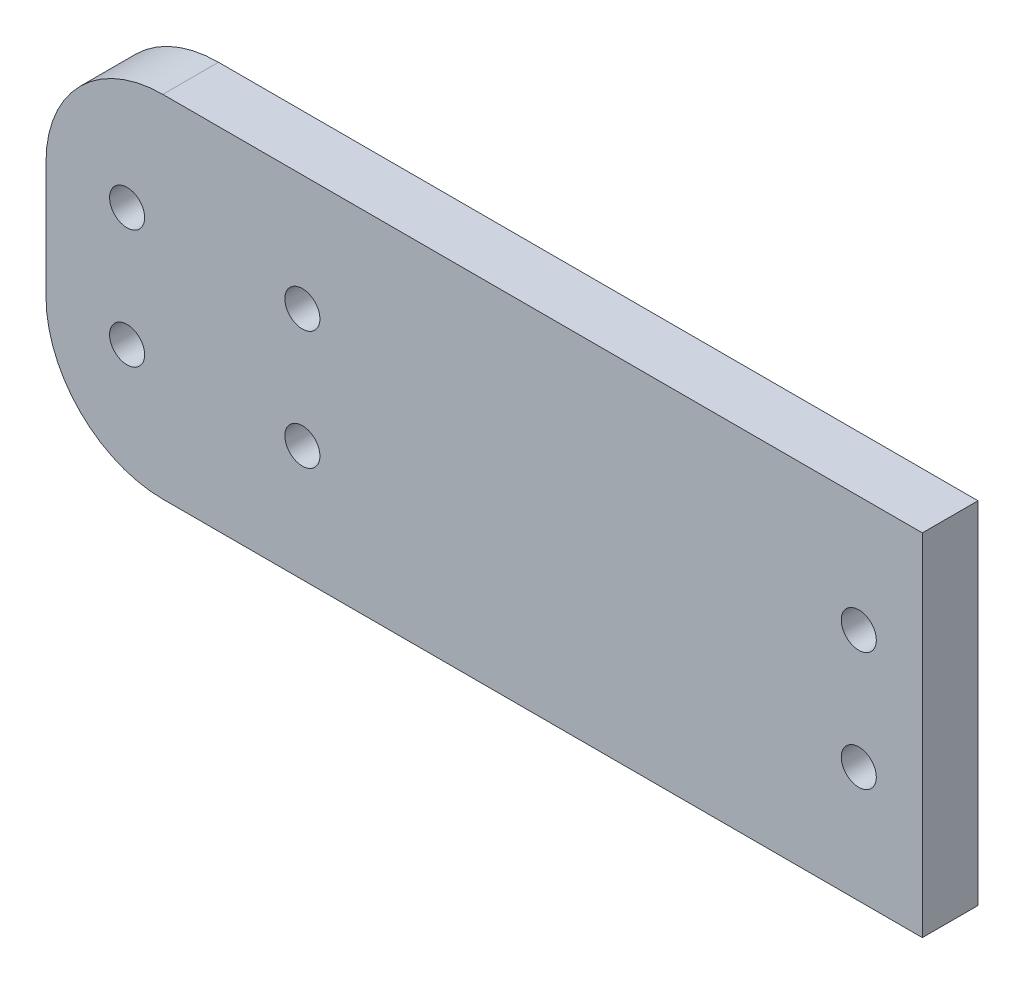
ISO-10303-21;
HEADER;
FILE_DESCRIPTION(('STEP AP214'),'2;1');
FILE_NAME('part.step','',(''),(''),'','','');
FILE_SCHEMA(('AUTOMOTIVE_DESIGN { 1 0 10303 214 1 1 1 1 }'));
ENDSEC;
DATA;
#1=APPLICATION_CONTEXT('core data for automotive mechanical design processes');
#2=APPLICATION_PROTOCOL_DEFINITION('international standard','automotive_design',2000,#1);
#3=PRODUCT_CONTEXT('',#1,'mechanical');
#4=PRODUCT('Part','Part','',(#3));
#5=PRODUCT_RELATED_PRODUCT_CATEGORY('part','',(#4));
#6=PRODUCT_DEFINITION_FORMATION('','',#4);
#7=PRODUCT_DEFINITION_CONTEXT('part definition',#1,'design');
#8=PRODUCT_DEFINITION('design','',#6,#7);
#9=PRODUCT_DEFINITION_SHAPE('','',#8);
#10=(LENGTH_UNIT() NAMED_UNIT(*) SI_UNIT(.MILLI.,.METRE.));
#11=(NAMED_UNIT(*) PLANE_ANGLE_UNIT() SI_UNIT($,.RADIAN.));
#12=(NAMED_UNIT(*) SI_UNIT($,.STERADIAN.) SOLID_ANGLE_UNIT());
#13=UNCERTAINTY_MEASURE_WITH_UNIT(LENGTH_MEASURE(1.E-05),#10,'distance_accuracy_value','');
#14=(GEOMETRIC_REPRESENTATION_CONTEXT(3) GLOBAL_UNCERTAINTY_ASSIGNED_CONTEXT((#13)) GLOBAL_UNIT_ASSIGNED_CONTEXT((#10,
#11,#12)) REPRESENTATION_CONTEXT('',''));
#15=CARTESIAN_POINT('',(0.,0.,0.));
#16=DIRECTION('',(0.,0.,1.));
#17=DIRECTION('',(1.,0.,0.));
#18=AXIS2_PLACEMENT_3D('',#15,#16,#17);
#19=CARTESIAN_POINT('',(37.5,15.,4.7625));
#20=DIRECTION('',(-1.,0.,0.));
#21=DIRECTION('',(0.,-1.,0.));
#22=AXIS2_PLACEMENT_3D('',#19,#20,#21);
#23=PLANE('',#22);
#24=DIRECTION('',(0.,1.,0.));
#25=VECTOR('',#24,1.);
#26=CARTESIAN_POINT('',(37.5,15.,0.));
#27=LINE('',#26,#25);
#28=CARTESIAN_POINT('',(37.5,-15.,0.));
#29=VERTEX_POINT('',#28);
#30=CARTESIAN_POINT('',(37.5,15.,0.));
#31=VERTEX_POINT('',#30);
#32=EDGE_CURVE('E108',#29,#31,#27,.T.);
#33=ORIENTED_EDGE('',*,*,#32,.T.);
#34=DIRECTION('',(0.,0.,-1.));
#35=VECTOR('',#34,1.);
#36=CARTESIAN_POINT('',(37.5,15.,4.7625));
#37=LINE('',#36,#35);
#38=CARTESIAN_POINT('',(37.5,15.,4.7625));
#39=VERTEX_POINT('',#38);
#40=EDGE_CURVE('E91',#39,#31,#37,.T.);
#41=ORIENTED_EDGE('',*,*,#40,.F.);
#42=DIRECTION('',(0.,1.,0.));
#43=VECTOR('',#42,1.);
#44=CARTESIAN_POINT('',(37.5,15.,4.7625));
#45=LINE('',#44,#43);
#46=CARTESIAN_POINT('',(37.5,-15.,4.7625));
#47=VERTEX_POINT('',#46);
#48=EDGE_CURVE('E96',#47,#39,#45,.T.);
#49=ORIENTED_EDGE('',*,*,#48,.F.);
#50=DIRECTION('',(0.,0.,-1.));
#51=VECTOR('',#50,1.);
#52=CARTESIAN_POINT('',(37.5,-15.,4.7625));
#53=LINE('',#52,#51);
#54=EDGE_CURVE('E110',#47,#29,#53,.T.);
#55=ORIENTED_EDGE('',*,*,#54,.T.);
#56=EDGE_LOOP('',(#33,#41,#49,#55));
#57=FACE_BOUND('',#56,.T.);
#58=ADVANCED_FACE('F33',(#57),#23,.F.);
#59=CARTESIAN_POINT('',(-37.5,15.,4.7625));
#60=DIRECTION('',(0.,-1.,0.));
#61=DIRECTION('',(0.,0.,-1.));
#62=AXIS2_PLACEMENT_3D('',#59,#60,#61);
#63=PLANE('',#62);
#64=DIRECTION('',(-1.,0.,0.));
#65=VECTOR('',#64,1.);
#66=CARTESIAN_POINT('',(-37.5,15.,0.));
#67=LINE('',#66,#65);
#68=CARTESIAN_POINT('',(-27.5,15.,0.));
#69=VERTEX_POINT('',#68);
#70=EDGE_CURVE('E147',#31,#69,#67,.T.);
#71=ORIENTED_EDGE('',*,*,#70,.T.);
#72=DIRECTION('',(0.,0.,-1.));
#73=VECTOR('',#72,1.);
#74=CARTESIAN_POINT('',(-27.5,15.,4.7625));
#75=LINE('',#74,#73);
#76=CARTESIAN_POINT('',(-27.5,15.,4.7625));
#77=VERTEX_POINT('',#76);
#78=EDGE_CURVE('E11',#69,#77,#75,.F.);
#79=ORIENTED_EDGE('',*,*,#78,.T.);
#80=DIRECTION('',(-1.,0.,0.));
#81=VECTOR('',#80,1.);
#82=CARTESIAN_POINT('',(-37.5,15.,4.7625));
#83=LINE('',#82,#81);
#84=EDGE_CURVE('E87',#39,#77,#83,.T.);
#85=ORIENTED_EDGE('',*,*,#84,.F.);
#86=ORIENTED_EDGE('',*,*,#40,.T.);
#87=EDGE_LOOP('',(#71,#79,#85,#86));
#88=FACE_BOUND('',#87,.T.);
#89=ADVANCED_FACE('F89',(#88),#63,.F.);
#90=CARTESIAN_POINT('',(-37.5,15.,4.7625));
#91=DIRECTION('',(1.,0.,0.));
#92=DIRECTION('',(0.,0.,-1.));
#93=AXIS2_PLACEMENT_3D('',#90,#91,#92);
#94=PLANE('',#93);
#95=DIRECTION('',(0.,-1.,0.));
#96=VECTOR('',#95,1.);
#97=CARTESIAN_POINT('',(-37.5,15.,0.));
#98=LINE('',#97,#96);
#99=CARTESIAN_POINT('',(-37.5,5.,0.));
#100=VERTEX_POINT('',#99);
#101=CARTESIAN_POINT('',(-37.5,-5.,0.));
#102=VERTEX_POINT('',#101);
#103=EDGE_CURVE('E149',#100,#102,#98,.T.);
#104=ORIENTED_EDGE('',*,*,#103,.T.);
#105=DIRECTION('',(0.,0.,-1.));
#106=VECTOR('',#105,1.);
#107=CARTESIAN_POINT('',(-37.5,-5.,4.7625));
#108=LINE('',#107,#106);
#109=CARTESIAN_POINT('',(-37.5,-5.,4.7625));
#110=VERTEX_POINT('',#109);
#111=EDGE_CURVE('E56',#102,#110,#108,.F.);
#112=ORIENTED_EDGE('',*,*,#111,.T.);
#113=DIRECTION('',(0.,-1.,0.));
#114=VECTOR('',#113,1.);
#115=CARTESIAN_POINT('',(-37.5,15.,4.7625));
#116=LINE('',#115,#114);
#117=CARTESIAN_POINT('',(-37.5,5.,4.7625));
#118=VERTEX_POINT('',#117);
#119=EDGE_CURVE('E95',#118,#110,#116,.T.);
#120=ORIENTED_EDGE('',*,*,#119,.F.);
#121=DIRECTION('',(0.,0.,-1.));
#122=VECTOR('',#121,1.);
#123=CARTESIAN_POINT('',(-37.5,5.,4.7625));
#124=LINE('',#123,#122);
#125=EDGE_CURVE('E121',#118,#100,#124,.T.);
#126=ORIENTED_EDGE('',*,*,#125,.T.);
#127=EDGE_LOOP('',(#104,#112,#120,#126));
#128=FACE_BOUND('',#127,.T.);
#129=ADVANCED_FACE('F164',(#128),#94,.F.);
#130=CARTESIAN_POINT('',(-37.5,-15.,4.7625));
#131=DIRECTION('',(0.,1.,0.));
#132=DIRECTION('',(0.,0.,1.));
#133=AXIS2_PLACEMENT_3D('',#130,#131,#132);
#134=PLANE('',#133);
#135=DIRECTION('',(1.,0.,0.));
#136=VECTOR('',#135,1.);
#137=CARTESIAN_POINT('',(-37.5,-15.,4.7625));
#138=LINE('',#137,#136);
#139=CARTESIAN_POINT('',(-27.5,-15.,4.7625));
#140=VERTEX_POINT('',#139);
#141=EDGE_CURVE('E101',#140,#47,#138,.T.);
#142=ORIENTED_EDGE('',*,*,#141,.F.);
#143=DIRECTION('',(0.,0.,-1.));
#144=VECTOR('',#143,1.);
#145=CARTESIAN_POINT('',(-27.5,-15.,4.7625));
#146=LINE('',#145,#144);
#147=CARTESIAN_POINT('',(-27.5,-15.,0.));
#148=VERTEX_POINT('',#147);
#149=EDGE_CURVE('E109',#140,#148,#146,.T.);
#150=ORIENTED_EDGE('',*,*,#149,.T.);
#151=DIRECTION('',(1.,0.,0.));
#152=VECTOR('',#151,1.);
#153=CARTESIAN_POINT('',(-37.5,-15.,0.));
#154=LINE('',#153,#152);
#155=EDGE_CURVE('E105',#148,#29,#154,.T.);
#156=ORIENTED_EDGE('',*,*,#155,.T.);
#157=ORIENTED_EDGE('',*,*,#54,.F.);
#158=EDGE_LOOP('',(#142,#150,#156,#157));
#159=FACE_BOUND('',#158,.T.);
#160=ADVANCED_FACE('F156',(#159),#134,.F.);
#161=CARTESIAN_POINT('',(0.,0.,4.7625));
#162=DIRECTION('',(0.,0.,1.));
#163=DIRECTION('',(1.,0.,0.));
#164=AXIS2_PLACEMENT_3D('',#161,#162,#163);
#165=PLANE('',#164);
#166=CARTESIAN_POINT('',(32.06,-5.08000000000001,4.7625));
#167=DIRECTION('',(0.,0.,1.));
#168=DIRECTION('',(1.,0.,0.));
#169=AXIS2_PLACEMENT_3D('',#166,#167,#168);
#170=CIRCLE('',#169,1.5);
#171=CARTESIAN_POINT('',(33.56,-5.08000000000001,4.7625));
#172=VERTEX_POINT('',#171);
#173=EDGE_CURVE('E175',#172,#172,#170,.T.);
#174=ORIENTED_EDGE('',*,*,#173,.F.);
#175=EDGE_LOOP('',(#174));
#176=FACE_BOUND('',#175,.T.);
#177=CARTESIAN_POINT('',(-15.56,-5.08,4.7625));
#178=DIRECTION('',(0.,0.,1.));
#179=DIRECTION('',(-1.,0.,0.));
#180=AXIS2_PLACEMENT_3D('',#177,#178,#179);
#181=CIRCLE('',#180,1.5);
#182=CARTESIAN_POINT('',(-17.06,-5.08,4.7625));
#183=VERTEX_POINT('',#182);
#184=EDGE_CURVE('E172',#183,#183,#181,.T.);
#185=ORIENTED_EDGE('',*,*,#184,.F.);
#186=EDGE_LOOP('',(#185));
#187=FACE_BOUND('',#186,.T.);
#188=CARTESIAN_POINT('',(-15.56,5.08,4.7625));
#189=DIRECTION('',(0.,0.,1.));
#190=DIRECTION('',(1.,0.,0.));
#191=AXIS2_PLACEMENT_3D('',#188,#189,#190);
#192=CIRCLE('',#191,1.5);
#193=CARTESIAN_POINT('',(-14.06,5.08,4.7625));
#194=VERTEX_POINT('',#193);
#195=EDGE_CURVE('E169',#194,#194,#192,.T.);
#196=ORIENTED_EDGE('',*,*,#195,.F.);
#197=EDGE_LOOP('',(#196));
#198=FACE_BOUND('',#197,.T.);
#199=CARTESIAN_POINT('',(-30.56,-5.0800000000001,4.7625));
#200=DIRECTION('',(0.,0.,1.));
#201=DIRECTION('',(-1.,0.,0.));
#202=AXIS2_PLACEMENT_3D('',#199,#200,#201);
#203=CIRCLE('',#202,1.5);
#204=CARTESIAN_POINT('',(-32.06,-5.0800000000001,4.7625));
#205=VERTEX_POINT('',#204);
#206=EDGE_CURVE('E168',#205,#205,#203,.T.);
#207=ORIENTED_EDGE('',*,*,#206,.F.);
#208=EDGE_LOOP('',(#207));
#209=FACE_BOUND('',#208,.T.);
#210=CARTESIAN_POINT('',(32.06,5.07999999999999,4.7625));
#211=DIRECTION('',(0.,0.,1.));
#212=DIRECTION('',(-1.,0.,0.));
#213=AXIS2_PLACEMENT_3D('',#210,#211,#212);
#214=CIRCLE('',#213,1.5);
#215=CARTESIAN_POINT('',(30.56,5.07999999999999,4.7625));
#216=VERTEX_POINT('',#215);
#217=EDGE_CURVE('E178',#216,#216,#214,.T.);
#218=ORIENTED_EDGE('',*,*,#217,.F.);
#219=EDGE_LOOP('',(#218));
#220=FACE_BOUND('',#219,.T.);
#221=CARTESIAN_POINT('',(-30.56,5.07999999999989,4.7625));
#222=DIRECTION('',(0.,0.,1.));
#223=DIRECTION('',(1.,0.,0.));
#224=AXIS2_PLACEMENT_3D('',#221,#222,#223);
#225=CIRCLE('',#224,1.5);
#226=CARTESIAN_POINT('',(-29.06,5.07999999999989,4.7625));
#227=VERTEX_POINT('',#226);
#228=EDGE_CURVE('E132',#227,#227,#225,.T.);
#229=ORIENTED_EDGE('',*,*,#228,.F.);
#230=EDGE_LOOP('',(#229));
#231=FACE_BOUND('',#230,.T.);
#232=ORIENTED_EDGE('',*,*,#119,.T.);
#233=CARTESIAN_POINT('',(-27.5,-5.,4.7625));
#234=DIRECTION('',(0.,0.,1.));
#235=DIRECTION('',(1.,0.,0.));
#236=AXIS2_PLACEMENT_3D('',#233,#234,#235);
#237=CIRCLE('',#236,10.);
#238=EDGE_CURVE('E42',#110,#140,#237,.T.);
#239=ORIENTED_EDGE('',*,*,#238,.T.);
#240=ORIENTED_EDGE('',*,*,#141,.T.);
#241=ORIENTED_EDGE('',*,*,#48,.T.);
#242=ORIENTED_EDGE('',*,*,#84,.T.);
#243=CARTESIAN_POINT('',(-27.5,5.,4.7625));
#244=DIRECTION('',(0.,0.,1.));
#245=DIRECTION('',(1.,0.,0.));
#246=AXIS2_PLACEMENT_3D('',#243,#244,#245);
#247=CIRCLE('',#246,10.);
#248=EDGE_CURVE('E125',#77,#118,#247,.T.);
#249=ORIENTED_EDGE('',*,*,#248,.T.);
#250=EDGE_LOOP('',(#232,#239,#240,#241,#242,#249));
#251=FACE_BOUND('',#250,.T.);
#252=ADVANCED_FACE('F99',(#176,#187,#198,#209,#220,#231,#251),#165,.T.);
#253=CARTESIAN_POINT('',(0.,0.,0.));
#254=DIRECTION('',(0.,0.,1.));
#255=DIRECTION('',(1.,0.,0.));
#256=AXIS2_PLACEMENT_3D('',#253,#254,#255);
#257=PLANE('',#256);
#258=CARTESIAN_POINT('',(32.06,-5.08000000000001,0.));
#259=DIRECTION('',(0.,0.,1.));
#260=DIRECTION('',(1.,0.,0.));
#261=AXIS2_PLACEMENT_3D('',#258,#259,#260);
#262=CIRCLE('',#261,1.5);
#263=CARTESIAN_POINT('',(33.56,-5.08000000000001,0.));
#264=VERTEX_POINT('',#263);
#265=EDGE_CURVE('E37',#264,#264,#262,.T.);
#266=ORIENTED_EDGE('',*,*,#265,.T.);
#267=EDGE_LOOP('',(#266));
#268=FACE_BOUND('',#267,.T.);
#269=CARTESIAN_POINT('',(-15.56,-5.08,0.));
#270=DIRECTION('',(0.,0.,1.));
#271=DIRECTION('',(1.,0.,0.));
#272=AXIS2_PLACEMENT_3D('',#269,#270,#271);
#273=CIRCLE('',#272,1.5);
#274=CARTESIAN_POINT('',(-14.06,-5.08,0.));
#275=VERTEX_POINT('',#274);
#276=EDGE_CURVE('E140',#275,#275,#273,.T.);
#277=ORIENTED_EDGE('',*,*,#276,.T.);
#278=EDGE_LOOP('',(#277));
#279=FACE_BOUND('',#278,.T.);
#280=CARTESIAN_POINT('',(-15.56,5.08,0.));
#281=DIRECTION('',(0.,0.,1.));
#282=DIRECTION('',(1.,0.,0.));
#283=AXIS2_PLACEMENT_3D('',#280,#281,#282);
#284=CIRCLE('',#283,1.5);
#285=CARTESIAN_POINT('',(-14.06,5.08,0.));
#286=VERTEX_POINT('',#285);
#287=EDGE_CURVE('E138',#286,#286,#284,.T.);
#288=ORIENTED_EDGE('',*,*,#287,.T.);
#289=EDGE_LOOP('',(#288));
#290=FACE_BOUND('',#289,.T.);
#291=CARTESIAN_POINT('',(-30.56,-5.0800000000001,0.));
#292=DIRECTION('',(0.,0.,1.));
#293=DIRECTION('',(1.,0.,0.));
#294=AXIS2_PLACEMENT_3D('',#291,#292,#293);
#295=CIRCLE('',#294,1.5);
#296=CARTESIAN_POINT('',(-29.06,-5.0800000000001,0.));
#297=VERTEX_POINT('',#296);
#298=EDGE_CURVE('E135',#297,#297,#295,.T.);
#299=ORIENTED_EDGE('',*,*,#298,.T.);
#300=EDGE_LOOP('',(#299));
#301=FACE_BOUND('',#300,.T.);
#302=CARTESIAN_POINT('',(32.06,5.07999999999999,0.));
#303=DIRECTION('',(0.,0.,1.));
#304=DIRECTION('',(1.,0.,0.));
#305=AXIS2_PLACEMENT_3D('',#302,#303,#304);
#306=CIRCLE('',#305,1.5);
#307=CARTESIAN_POINT('',(33.56,5.07999999999999,0.));
#308=VERTEX_POINT('',#307);
#309=EDGE_CURVE('E131',#308,#308,#306,.T.);
#310=ORIENTED_EDGE('',*,*,#309,.T.);
#311=EDGE_LOOP('',(#310));
#312=FACE_BOUND('',#311,.T.);
#313=CARTESIAN_POINT('',(-30.56,5.07999999999989,0.));
#314=DIRECTION('',(0.,0.,1.));
#315=DIRECTION('',(1.,0.,0.));
#316=AXIS2_PLACEMENT_3D('',#313,#314,#315);
#317=CIRCLE('',#316,1.5);
#318=CARTESIAN_POINT('',(-29.06,5.07999999999989,0.));
#319=VERTEX_POINT('',#318);
#320=EDGE_CURVE('E128',#319,#319,#317,.T.);
#321=ORIENTED_EDGE('',*,*,#320,.T.);
#322=EDGE_LOOP('',(#321));
#323=FACE_BOUND('',#322,.T.);
#324=ORIENTED_EDGE('',*,*,#155,.F.);
#325=CARTESIAN_POINT('',(-27.5,-5.,0.));
#326=DIRECTION('',(0.,0.,1.));
#327=DIRECTION('',(1.,0.,0.));
#328=AXIS2_PLACEMENT_3D('',#325,#326,#327);
#329=CIRCLE('',#328,10.);
#330=EDGE_CURVE('E119',#148,#102,#329,.F.);
#331=ORIENTED_EDGE('',*,*,#330,.T.);
#332=ORIENTED_EDGE('',*,*,#103,.F.);
#333=CARTESIAN_POINT('',(-27.5,5.,0.));
#334=DIRECTION('',(0.,0.,1.));
#335=DIRECTION('',(1.,0.,0.));
#336=AXIS2_PLACEMENT_3D('',#333,#334,#335);
#337=CIRCLE('',#336,10.);
#338=EDGE_CURVE('E113',#100,#69,#337,.F.);
#339=ORIENTED_EDGE('',*,*,#338,.T.);
#340=ORIENTED_EDGE('',*,*,#70,.F.);
#341=ORIENTED_EDGE('',*,*,#32,.F.);
#342=EDGE_LOOP('',(#324,#331,#332,#339,#340,#341));
#343=FACE_BOUND('',#342,.T.);
#344=ADVANCED_FACE('F159',(#268,#279,#290,#301,#312,#323,#343),#257,.F.);
#345=CARTESIAN_POINT('',(-27.5,-5.,4.7625));
#346=DIRECTION('',(0.,0.,-1.));
#347=DIRECTION('',(-1.,0.,0.));
#348=AXIS2_PLACEMENT_3D('',#345,#346,#347);
#349=CYLINDRICAL_SURFACE('',#348,10.);
#350=ORIENTED_EDGE('',*,*,#238,.F.);
#351=ORIENTED_EDGE('',*,*,#111,.F.);
#352=ORIENTED_EDGE('',*,*,#330,.F.);
#353=ORIENTED_EDGE('',*,*,#149,.F.);
#354=EDGE_LOOP('',(#350,#351,#352,#353));
#355=FACE_BOUND('',#354,.T.);
#356=ADVANCED_FACE('F200',(#355),#349,.T.);
#357=CARTESIAN_POINT('',(-27.5,5.,4.7625));
#358=DIRECTION('',(0.,0.,-1.));
#359=DIRECTION('',(-1.,0.,0.));
#360=AXIS2_PLACEMENT_3D('',#357,#358,#359);
#361=CYLINDRICAL_SURFACE('',#360,10.);
#362=ORIENTED_EDGE('',*,*,#248,.F.);
#363=ORIENTED_EDGE('',*,*,#78,.F.);
#364=ORIENTED_EDGE('',*,*,#338,.F.);
#365=ORIENTED_EDGE('',*,*,#125,.F.);
#366=EDGE_LOOP('',(#362,#363,#364,#365));
#367=FACE_BOUND('',#366,.T.);
#368=ADVANCED_FACE('F35',(#367),#361,.T.);
#369=CARTESIAN_POINT('',(-30.56,5.07999999999989,-5.2375));
#370=DIRECTION('',(0.,0.,1.));
#371=DIRECTION('',(1.,0.,0.));
#372=AXIS2_PLACEMENT_3D('',#369,#370,#371);
#373=CYLINDRICAL_SURFACE('',#372,1.5);
#374=ORIENTED_EDGE('',*,*,#228,.T.);
#375=EDGE_LOOP('',(#374));
#376=FACE_BOUND('',#375,.T.);
#377=ORIENTED_EDGE('',*,*,#320,.F.);
#378=EDGE_LOOP('',(#377));
#379=FACE_BOUND('',#378,.T.);
#380=ADVANCED_FACE('F193',(#376,#379),#373,.F.);
#381=CARTESIAN_POINT('',(32.06,5.07999999999999,-5.2375));
#382=DIRECTION('',(0.,0.,1.));
#383=DIRECTION('',(1.,0.,0.));
#384=AXIS2_PLACEMENT_3D('',#381,#382,#383);
#385=CYLINDRICAL_SURFACE('',#384,1.5);
#386=ORIENTED_EDGE('',*,*,#217,.T.);
#387=EDGE_LOOP('',(#386));
#388=FACE_BOUND('',#387,.T.);
#389=ORIENTED_EDGE('',*,*,#309,.F.);
#390=EDGE_LOOP('',(#389));
#391=FACE_BOUND('',#390,.T.);
#392=ADVANCED_FACE('F184',(#388,#391),#385,.F.);
#393=CARTESIAN_POINT('',(-30.56,-5.0800000000001,-5.2375));
#394=DIRECTION('',(0.,0.,1.));
#395=DIRECTION('',(1.,0.,0.));
#396=AXIS2_PLACEMENT_3D('',#393,#394,#395);
#397=CYLINDRICAL_SURFACE('',#396,1.5);
#398=ORIENTED_EDGE('',*,*,#206,.T.);
#399=EDGE_LOOP('',(#398));
#400=FACE_BOUND('',#399,.T.);
#401=ORIENTED_EDGE('',*,*,#298,.F.);
#402=EDGE_LOOP('',(#401));
#403=FACE_BOUND('',#402,.T.);
#404=ADVANCED_FACE('F249',(#400,#403),#397,.F.);
#405=CARTESIAN_POINT('',(-15.56,5.08,-5.2375));
#406=DIRECTION('',(0.,0.,1.));
#407=DIRECTION('',(1.,0.,0.));
#408=AXIS2_PLACEMENT_3D('',#405,#406,#407);
#409=CYLINDRICAL_SURFACE('',#408,1.5);
#410=ORIENTED_EDGE('',*,*,#195,.T.);
#411=EDGE_LOOP('',(#410));
#412=FACE_BOUND('',#411,.T.);
#413=ORIENTED_EDGE('',*,*,#287,.F.);
#414=EDGE_LOOP('',(#413));
#415=FACE_BOUND('',#414,.T.);
#416=ADVANCED_FACE('F258',(#412,#415),#409,.F.);
#417=CARTESIAN_POINT('',(-15.56,-5.08,-5.2375));
#418=DIRECTION('',(0.,0.,1.));
#419=DIRECTION('',(1.,0.,0.));
#420=AXIS2_PLACEMENT_3D('',#417,#418,#419);
#421=CYLINDRICAL_SURFACE('',#420,1.5);
#422=ORIENTED_EDGE('',*,*,#184,.T.);
#423=EDGE_LOOP('',(#422));
#424=FACE_BOUND('',#423,.T.);
#425=ORIENTED_EDGE('',*,*,#276,.F.);
#426=EDGE_LOOP('',(#425));
#427=FACE_BOUND('',#426,.T.);
#428=ADVANCED_FACE('F268',(#424,#427),#421,.F.);
#429=CARTESIAN_POINT('',(32.06,-5.08000000000001,-5.2375));
#430=DIRECTION('',(0.,0.,1.));
#431=DIRECTION('',(1.,0.,0.));
#432=AXIS2_PLACEMENT_3D('',#429,#430,#431);
#433=CYLINDRICAL_SURFACE('',#432,1.5);
#434=ORIENTED_EDGE('',*,*,#173,.T.);
#435=EDGE_LOOP('',(#434));
#436=FACE_BOUND('',#435,.T.);
#437=ORIENTED_EDGE('',*,*,#265,.F.);
#438=EDGE_LOOP('',(#437));
#439=FACE_BOUND('',#438,.T.);
#440=ADVANCED_FACE('F278',(#436,#439),#433,.F.);
#441=CLOSED_SHELL('',(#58,#89,#129,#160,#252,#344,#356,#368,#380,#392,#404,#416,#428,#440));
#442=MANIFOLD_SOLID_BREP('B2',#441);
#443=ADVANCED_BREP_SHAPE_REPRESENTATION('',(#18,#442),#14);
#444=SHAPE_DEFINITION_REPRESENTATION(#9,#443);
ENDSEC;
END-ISO-10303-21;
